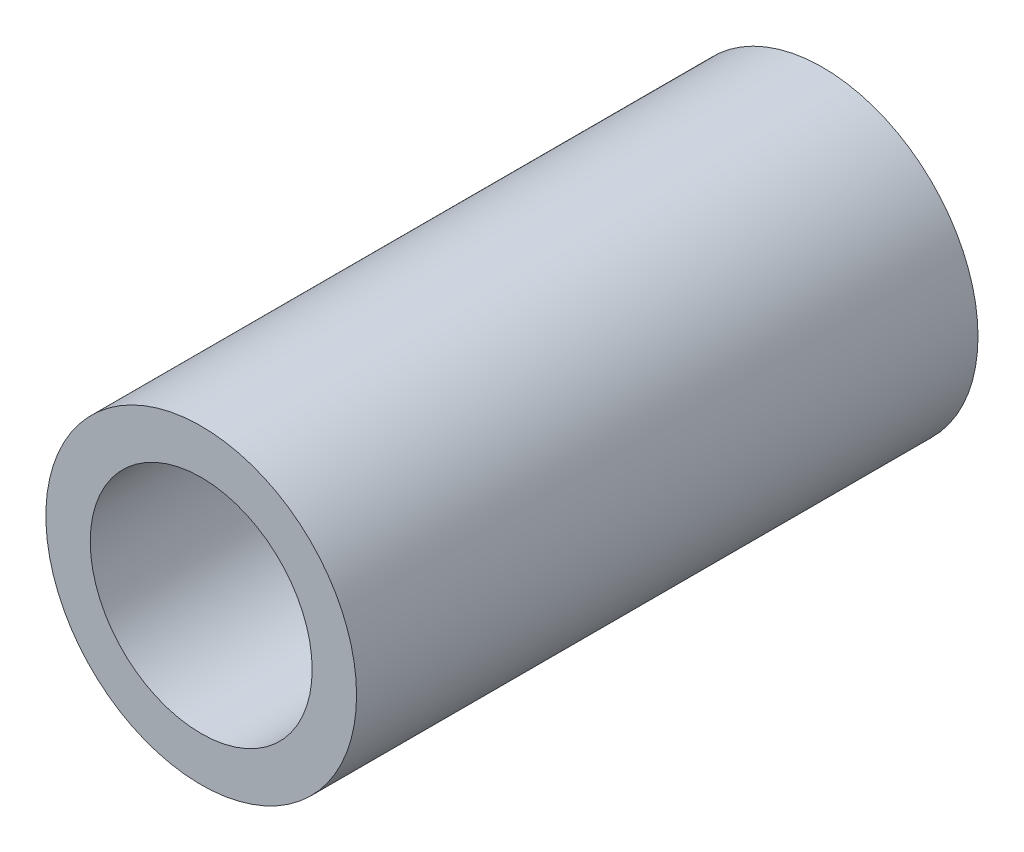
ISO-10303-21;
HEADER;
FILE_DESCRIPTION(('STEP AP214'),'2;1');
FILE_NAME('part.step','',(''),(''),'','','');
FILE_SCHEMA(('AUTOMOTIVE_DESIGN { 1 0 10303 214 1 1 1 1 }'));
ENDSEC;
DATA;
#1=APPLICATION_CONTEXT('core data for automotive mechanical design processes');
#2=APPLICATION_PROTOCOL_DEFINITION('international standard','automotive_design',2000,#1);
#3=PRODUCT_CONTEXT('',#1,'mechanical');
#4=PRODUCT('Part','Part','',(#3));
#5=PRODUCT_RELATED_PRODUCT_CATEGORY('part','',(#4));
#6=PRODUCT_DEFINITION_FORMATION('','',#4);
#7=PRODUCT_DEFINITION_CONTEXT('part definition',#1,'design');
#8=PRODUCT_DEFINITION('design','',#6,#7);
#9=PRODUCT_DEFINITION_SHAPE('','',#8);
#10=(LENGTH_UNIT() NAMED_UNIT(*) SI_UNIT(.MILLI.,.METRE.));
#11=(NAMED_UNIT(*) PLANE_ANGLE_UNIT() SI_UNIT($,.RADIAN.));
#12=(NAMED_UNIT(*) SI_UNIT($,.STERADIAN.) SOLID_ANGLE_UNIT());
#13=UNCERTAINTY_MEASURE_WITH_UNIT(LENGTH_MEASURE(1.E-05),#10,'distance_accuracy_value','');
#14=(GEOMETRIC_REPRESENTATION_CONTEXT(3) GLOBAL_UNCERTAINTY_ASSIGNED_CONTEXT((#13)) GLOBAL_UNIT_ASSIGNED_CONTEXT((#10,
#11,#12)) REPRESENTATION_CONTEXT('',''));
#15=CARTESIAN_POINT('',(0.,0.,0.));
#16=DIRECTION('',(0.,0.,1.));
#17=DIRECTION('',(1.,0.,0.));
#18=AXIS2_PLACEMENT_3D('',#15,#16,#17);
#19=CARTESIAN_POINT('',(0.,0.,14.));
#20=DIRECTION('',(0.,0.,1.));
#21=DIRECTION('',(1.,0.,0.));
#22=AXIS2_PLACEMENT_3D('',#19,#20,#21);
#23=PLANE('',#22);
#24=CARTESIAN_POINT('',(0.,0.,14.));
#25=DIRECTION('',(0.,0.,1.));
#26=DIRECTION('',(1.,0.,0.));
#27=AXIS2_PLACEMENT_3D('',#24,#25,#26);
#28=CIRCLE('',#27,3.5);
#29=CARTESIAN_POINT('',(3.5,0.,14.));
#30=VERTEX_POINT('',#29);
#31=EDGE_CURVE('E10',#30,#30,#28,.T.);
#32=ORIENTED_EDGE('',*,*,#31,.T.);
#33=EDGE_LOOP('',(#32));
#34=FACE_BOUND('',#33,.T.);
#35=CARTESIAN_POINT('',(0.,0.,14.));
#36=DIRECTION('',(0.,0.,1.));
#37=DIRECTION('',(1.,0.,0.));
#38=AXIS2_PLACEMENT_3D('',#35,#36,#37);
#39=CIRCLE('',#38,2.5);
#40=CARTESIAN_POINT('',(2.5,0.,14.));
#41=VERTEX_POINT('',#40);
#42=EDGE_CURVE('E42',#41,#41,#39,.T.);
#43=ORIENTED_EDGE('',*,*,#42,.F.);
#44=EDGE_LOOP('',(#43));
#45=FACE_BOUND('',#44,.T.);
#46=ADVANCED_FACE('F31',(#34,#45),#23,.T.);
#47=CARTESIAN_POINT('',(0.,0.,0.));
#48=DIRECTION('',(0.,0.,1.));
#49=DIRECTION('',(1.,0.,0.));
#50=AXIS2_PLACEMENT_3D('',#47,#48,#49);
#51=PLANE('',#50);
#52=CARTESIAN_POINT('',(0.,0.,0.));
#53=DIRECTION('',(0.,0.,1.));
#54=DIRECTION('',(1.,0.,0.));
#55=AXIS2_PLACEMENT_3D('',#52,#53,#54);
#56=CIRCLE('',#55,3.5);
#57=CARTESIAN_POINT('',(3.5,0.,0.));
#58=VERTEX_POINT('',#57);
#59=EDGE_CURVE('E35',#58,#58,#56,.T.);
#60=ORIENTED_EDGE('',*,*,#59,.F.);
#61=EDGE_LOOP('',(#60));
#62=FACE_BOUND('',#61,.T.);
#63=CARTESIAN_POINT('',(0.,0.,0.));
#64=DIRECTION('',(0.,0.,1.));
#65=DIRECTION('',(1.,0.,0.));
#66=AXIS2_PLACEMENT_3D('',#63,#64,#65);
#67=CIRCLE('',#66,2.5);
#68=CARTESIAN_POINT('',(2.5,0.,0.));
#69=VERTEX_POINT('',#68);
#70=EDGE_CURVE('E44',#69,#69,#67,.T.);
#71=ORIENTED_EDGE('',*,*,#70,.T.);
#72=EDGE_LOOP('',(#71));
#73=FACE_BOUND('',#72,.T.);
#74=ADVANCED_FACE('F54',(#62,#73),#51,.F.);
#75=CARTESIAN_POINT('',(0.,0.,14.));
#76=DIRECTION('',(0.,0.,-1.));
#77=DIRECTION('',(-1.,0.,0.));
#78=AXIS2_PLACEMENT_3D('',#75,#76,#77);
#79=CYLINDRICAL_SURFACE('',#78,3.5);
#80=ORIENTED_EDGE('',*,*,#31,.F.);
#81=EDGE_LOOP('',(#80));
#82=FACE_BOUND('',#81,.T.);
#83=ORIENTED_EDGE('',*,*,#59,.T.);
#84=EDGE_LOOP('',(#83));
#85=FACE_BOUND('',#84,.T.);
#86=ADVANCED_FACE('F33',(#82,#85),#79,.T.);
#87=CARTESIAN_POINT('',(0.,0.,14.));
#88=DIRECTION('',(0.,0.,-1.));
#89=DIRECTION('',(-1.,0.,0.));
#90=AXIS2_PLACEMENT_3D('',#87,#88,#89);
#91=CYLINDRICAL_SURFACE('',#90,2.5);
#92=ORIENTED_EDGE('',*,*,#42,.T.);
#93=EDGE_LOOP('',(#92));
#94=FACE_BOUND('',#93,.T.);
#95=ORIENTED_EDGE('',*,*,#70,.F.);
#96=EDGE_LOOP('',(#95));
#97=FACE_BOUND('',#96,.T.);
#98=ADVANCED_FACE('F50',(#94,#97),#91,.F.);
#99=CLOSED_SHELL('',(#46,#74,#86,#98));
#100=MANIFOLD_SOLID_BREP('B2',#99);
#101=ADVANCED_BREP_SHAPE_REPRESENTATION('',(#18,#100),#14);
#102=SHAPE_DEFINITION_REPRESENTATION(#9,#101);
ENDSEC;
END-ISO-10303-21;
